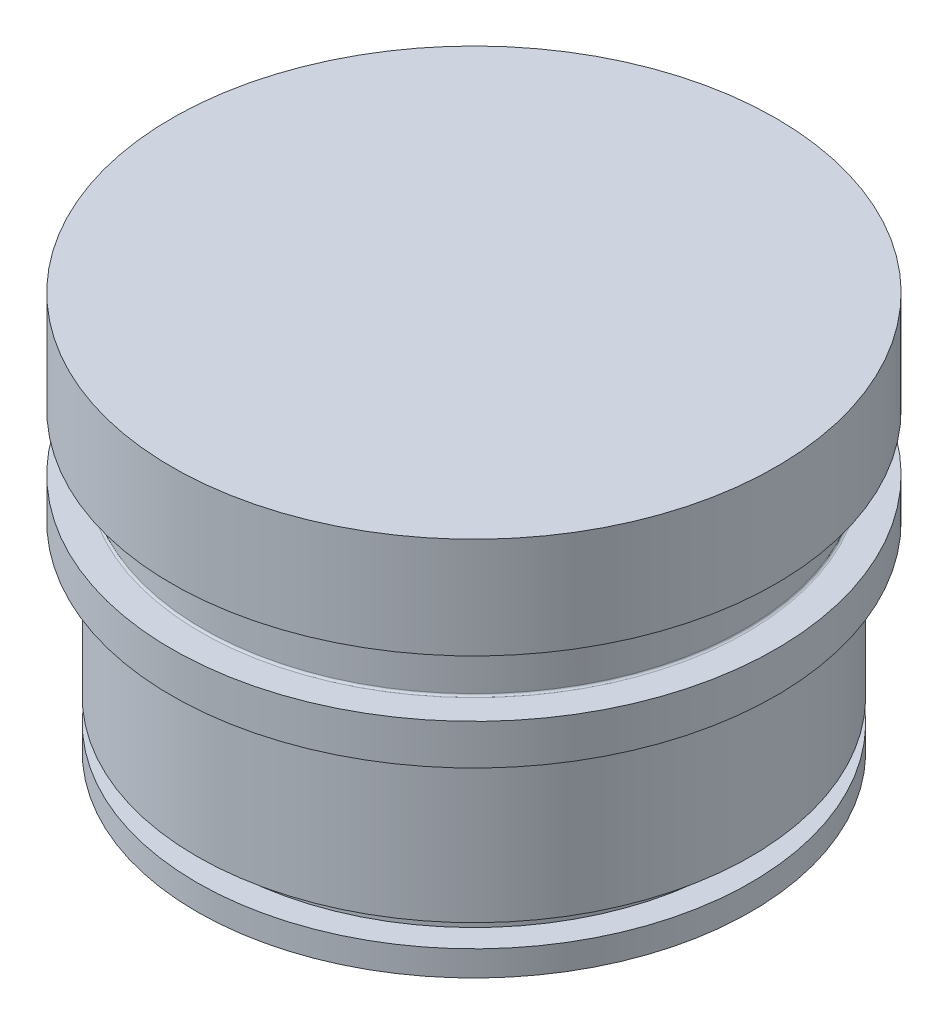
ISO-10303-21;
HEADER;
FILE_DESCRIPTION(('STEP AP214'),'2;1');
FILE_NAME('part.step','',(''),(''),'','','');
FILE_SCHEMA(('AUTOMOTIVE_DESIGN { 1 0 10303 214 1 1 1 1 }'));
ENDSEC;
DATA;
#1=APPLICATION_CONTEXT('core data for automotive mechanical design processes');
#2=APPLICATION_PROTOCOL_DEFINITION('international standard','automotive_design',2000,#1);
#3=PRODUCT_CONTEXT('',#1,'mechanical');
#4=PRODUCT('Part','Part','',(#3));
#5=PRODUCT_RELATED_PRODUCT_CATEGORY('part','',(#4));
#6=PRODUCT_DEFINITION_FORMATION('','',#4);
#7=PRODUCT_DEFINITION_CONTEXT('part definition',#1,'design');
#8=PRODUCT_DEFINITION('design','',#6,#7);
#9=PRODUCT_DEFINITION_SHAPE('','',#8);
#10=(LENGTH_UNIT() NAMED_UNIT(*) SI_UNIT(.MILLI.,.METRE.));
#11=(NAMED_UNIT(*) PLANE_ANGLE_UNIT() SI_UNIT($,.RADIAN.));
#12=(NAMED_UNIT(*) SI_UNIT($,.STERADIAN.) SOLID_ANGLE_UNIT());
#13=UNCERTAINTY_MEASURE_WITH_UNIT(LENGTH_MEASURE(1.E-05),#10,'distance_accuracy_value','');
#14=(GEOMETRIC_REPRESENTATION_CONTEXT(3) GLOBAL_UNCERTAINTY_ASSIGNED_CONTEXT((#13)) GLOBAL_UNIT_ASSIGNED_CONTEXT((#10,
#11,#12)) REPRESENTATION_CONTEXT('',''));
#15=CARTESIAN_POINT('',(0.,0.,0.));
#16=DIRECTION('',(0.,0.,1.));
#17=DIRECTION('',(1.,0.,0.));
#18=AXIS2_PLACEMENT_3D('',#15,#16,#17);
#19=CARTESIAN_POINT('',(0.,0.,0.));
#20=DIRECTION('',(0.,1.,0.));
#21=DIRECTION('',(0.,0.,1.));
#22=AXIS2_PLACEMENT_3D('',#19,#20,#21);
#23=PLANE('',#22);
#24=CARTESIAN_POINT('',(0.,0.,0.));
#25=DIRECTION('',(0.,-1.,0.));
#26=DIRECTION('',(0.,0.,-1.));
#27=AXIS2_PLACEMENT_3D('',#24,#25,#26);
#28=CIRCLE('',#27,17.399);
#29=CARTESIAN_POINT('',(0.,0.,-17.399));
#30=VERTEX_POINT('',#29);
#31=EDGE_CURVE('E57',#30,#30,#28,.T.);
#32=ORIENTED_EDGE('',*,*,#31,.T.);
#33=EDGE_LOOP('',(#32));
#34=FACE_BOUND('',#33,.T.);
#35=ADVANCED_FACE('F37',(#34),#23,.F.);
#36=CARTESIAN_POINT('',(0.,0.,0.));
#37=DIRECTION('',(0.,-1.,0.));
#38=DIRECTION('',(0.,0.,-1.));
#39=AXIS2_PLACEMENT_3D('',#36,#37,#38);
#40=CYLINDRICAL_SURFACE('',#39,17.399);
#41=ORIENTED_EDGE('',*,*,#31,.F.);
#42=EDGE_LOOP('',(#41));
#43=FACE_BOUND('',#42,.T.);
#44=CARTESIAN_POINT('',(0.,1.5875,0.));
#45=DIRECTION('',(0.,-1.,0.));
#46=DIRECTION('',(0.,0.,-1.));
#47=AXIS2_PLACEMENT_3D('',#44,#45,#46);
#48=CIRCLE('',#47,17.399);
#49=CARTESIAN_POINT('',(0.,1.5875,-17.399));
#50=VERTEX_POINT('',#49);
#51=EDGE_CURVE('E60',#50,#50,#48,.T.);
#52=ORIENTED_EDGE('',*,*,#51,.T.);
#53=EDGE_LOOP('',(#52));
#54=FACE_BOUND('',#53,.T.);
#55=ADVANCED_FACE('F103',(#43,#54),#40,.T.);
#56=CARTESIAN_POINT('',(-17.399,1.5875,0.));
#57=DIRECTION('',(0.,-1.,0.));
#58=DIRECTION('',(0.,0.,-1.));
#59=AXIS2_PLACEMENT_3D('',#56,#57,#58);
#60=PLANE('',#59);
#61=ORIENTED_EDGE('',*,*,#51,.F.);
#62=EDGE_LOOP('',(#61));
#63=FACE_BOUND('',#62,.T.);
#64=CARTESIAN_POINT('',(0.,1.5875,0.));
#65=DIRECTION('',(0.,-1.,0.));
#66=DIRECTION('',(0.,0.,-1.));
#67=AXIS2_PLACEMENT_3D('',#64,#65,#66);
#68=CIRCLE('',#67,15.7607);
#69=CARTESIAN_POINT('',(0.,1.5875,-15.7607));
#70=VERTEX_POINT('',#69);
#71=EDGE_CURVE('E63',#70,#70,#68,.T.);
#72=ORIENTED_EDGE('',*,*,#71,.T.);
#73=EDGE_LOOP('',(#72));
#74=FACE_BOUND('',#73,.T.);
#75=ADVANCED_FACE('F109',(#63,#74),#60,.F.);
#76=CARTESIAN_POINT('',(0.,0.,0.));
#77=DIRECTION('',(0.,-1.,0.));
#78=DIRECTION('',(0.,0.,-1.));
#79=AXIS2_PLACEMENT_3D('',#76,#77,#78);
#80=CYLINDRICAL_SURFACE('',#79,15.7607);
#81=ORIENTED_EDGE('',*,*,#71,.F.);
#82=EDGE_LOOP('',(#81));
#83=FACE_BOUND('',#82,.T.);
#84=CARTESIAN_POINT('',(0.,3.0099,0.));
#85=DIRECTION('',(0.,-1.,0.));
#86=DIRECTION('',(0.,0.,-1.));
#87=AXIS2_PLACEMENT_3D('',#84,#85,#86);
#88=CIRCLE('',#87,15.7607);
#89=CARTESIAN_POINT('',(0.,3.0099,-15.7607));
#90=VERTEX_POINT('',#89);
#91=EDGE_CURVE('E66',#90,#90,#88,.T.);
#92=ORIENTED_EDGE('',*,*,#91,.T.);
#93=EDGE_LOOP('',(#92));
#94=FACE_BOUND('',#93,.T.);
#95=ADVANCED_FACE('F115',(#83,#94),#80,.T.);
#96=CARTESIAN_POINT('',(-15.7607,3.0099,0.));
#97=DIRECTION('',(0.,1.,0.));
#98=DIRECTION('',(0.,0.,1.));
#99=AXIS2_PLACEMENT_3D('',#96,#97,#98);
#100=PLANE('',#99);
#101=ORIENTED_EDGE('',*,*,#91,.F.);
#102=EDGE_LOOP('',(#101));
#103=FACE_BOUND('',#102,.T.);
#104=CARTESIAN_POINT('',(0.,3.0099,0.));
#105=DIRECTION('',(0.,-1.,0.));
#106=DIRECTION('',(0.,0.,-1.));
#107=AXIS2_PLACEMENT_3D('',#104,#105,#106);
#108=CIRCLE('',#107,17.399);
#109=CARTESIAN_POINT('',(0.,3.0099,-17.399));
#110=VERTEX_POINT('',#109);
#111=EDGE_CURVE('E69',#110,#110,#108,.T.);
#112=ORIENTED_EDGE('',*,*,#111,.T.);
#113=EDGE_LOOP('',(#112));
#114=FACE_BOUND('',#113,.T.);
#115=ADVANCED_FACE('F119',(#103,#114),#100,.F.);
#116=CARTESIAN_POINT('',(0.,0.,0.));
#117=DIRECTION('',(0.,-1.,0.));
#118=DIRECTION('',(0.,0.,-1.));
#119=AXIS2_PLACEMENT_3D('',#116,#117,#118);
#120=CYLINDRICAL_SURFACE('',#119,17.399);
#121=ORIENTED_EDGE('',*,*,#111,.F.);
#122=EDGE_LOOP('',(#121));
#123=FACE_BOUND('',#122,.T.);
#124=CARTESIAN_POINT('',(0.,12.5349,0.));
#125=DIRECTION('',(0.,-1.,0.));
#126=DIRECTION('',(0.,0.,-1.));
#127=AXIS2_PLACEMENT_3D('',#124,#125,#126);
#128=CIRCLE('',#127,17.399);
#129=CARTESIAN_POINT('',(0.,12.5349,-17.399));
#130=VERTEX_POINT('',#129);
#131=EDGE_CURVE('E72',#130,#130,#128,.T.);
#132=ORIENTED_EDGE('',*,*,#131,.T.);
#133=EDGE_LOOP('',(#132));
#134=FACE_BOUND('',#133,.T.);
#135=ADVANCED_FACE('F123',(#123,#134),#120,.T.);
#136=CARTESIAN_POINT('',(-17.399,12.5349,0.));
#137=DIRECTION('',(0.,1.,0.));
#138=DIRECTION('',(0.,0.,1.));
#139=AXIS2_PLACEMENT_3D('',#136,#137,#138);
#140=PLANE('',#139);
#141=ORIENTED_EDGE('',*,*,#131,.F.);
#142=EDGE_LOOP('',(#141));
#143=FACE_BOUND('',#142,.T.);
#144=CARTESIAN_POINT('',(0.,12.5349,0.));
#145=DIRECTION('',(0.,-1.,0.));
#146=DIRECTION('',(0.,0.,-1.));
#147=AXIS2_PLACEMENT_3D('',#144,#145,#146);
#148=CIRCLE('',#147,18.9738);
#149=CARTESIAN_POINT('',(0.,12.5349,-18.9738));
#150=VERTEX_POINT('',#149);
#151=EDGE_CURVE('E75',#150,#150,#148,.T.);
#152=ORIENTED_EDGE('',*,*,#151,.T.);
#153=EDGE_LOOP('',(#152));
#154=FACE_BOUND('',#153,.T.);
#155=ADVANCED_FACE('F127',(#143,#154),#140,.F.);
#156=CARTESIAN_POINT('',(0.,0.,0.));
#157=DIRECTION('',(0.,-1.,0.));
#158=DIRECTION('',(0.,0.,-1.));
#159=AXIS2_PLACEMENT_3D('',#156,#157,#158);
#160=CYLINDRICAL_SURFACE('',#159,18.9738);
#161=ORIENTED_EDGE('',*,*,#151,.F.);
#162=EDGE_LOOP('',(#161));
#163=FACE_BOUND('',#162,.T.);
#164=CARTESIAN_POINT('',(0.,15.0749,0.));
#165=DIRECTION('',(0.,-1.,0.));
#166=DIRECTION('',(0.,0.,-1.));
#167=AXIS2_PLACEMENT_3D('',#164,#165,#166);
#168=CIRCLE('',#167,18.9738);
#169=CARTESIAN_POINT('',(0.,15.0749,-18.9738));
#170=VERTEX_POINT('',#169);
#171=EDGE_CURVE('E78',#170,#170,#168,.T.);
#172=ORIENTED_EDGE('',*,*,#171,.T.);
#173=EDGE_LOOP('',(#172));
#174=FACE_BOUND('',#173,.T.);
#175=ADVANCED_FACE('F131',(#163,#174),#160,.T.);
#176=CARTESIAN_POINT('',(-18.9738,15.0749,0.));
#177=DIRECTION('',(0.,-1.,0.));
#178=DIRECTION('',(0.,0.,-1.));
#179=AXIS2_PLACEMENT_3D('',#176,#177,#178);
#180=PLANE('',#179);
#181=CARTESIAN_POINT('',(0.,15.0749,0.));
#182=DIRECTION('',(0.,-1.,0.));
#183=DIRECTION('',(0.,0.,-1.));
#184=AXIS2_PLACEMENT_3D('',#181,#182,#183);
#185=CIRCLE('',#184,17.145);
#186=CARTESIAN_POINT('',(0.,15.0749,-17.145));
#187=VERTEX_POINT('',#186);
#188=EDGE_CURVE('E52',#187,#187,#185,.T.);
#189=ORIENTED_EDGE('',*,*,#188,.T.);
#190=EDGE_LOOP('',(#189));
#191=FACE_BOUND('',#190,.T.);
#192=ORIENTED_EDGE('',*,*,#171,.F.);
#193=EDGE_LOOP('',(#192));
#194=FACE_BOUND('',#193,.T.);
#195=ADVANCED_FACE('F135',(#191,#194),#180,.F.);
#196=CARTESIAN_POINT('',(0.,0.,0.));
#197=DIRECTION('',(0.,-1.,0.));
#198=DIRECTION('',(0.,0.,-1.));
#199=AXIS2_PLACEMENT_3D('',#196,#197,#198);
#200=CYLINDRICAL_SURFACE('',#199,17.018);
#201=CARTESIAN_POINT('',(0.,15.2019,0.));
#202=DIRECTION('',(0.,-1.,0.));
#203=DIRECTION('',(0.,0.,-1.));
#204=AXIS2_PLACEMENT_3D('',#201,#202,#203);
#205=CIRCLE('',#204,17.018);
#206=CARTESIAN_POINT('',(0.,15.2019,-17.018));
#207=VERTEX_POINT('',#206);
#208=EDGE_CURVE('E44',#207,#207,#205,.F.);
#209=ORIENTED_EDGE('',*,*,#208,.T.);
#210=EDGE_LOOP('',(#209));
#211=FACE_BOUND('',#210,.T.);
#212=CARTESIAN_POINT('',(0.,18.5039,0.));
#213=DIRECTION('',(0.,1.,0.));
#214=DIRECTION('',(0.,0.,1.));
#215=AXIS2_PLACEMENT_3D('',#212,#213,#214);
#216=CIRCLE('',#215,17.018);
#217=CARTESIAN_POINT('',(0.,18.5039,17.018));
#218=VERTEX_POINT('',#217);
#219=EDGE_CURVE('E48',#218,#218,#216,.F.);
#220=ORIENTED_EDGE('',*,*,#219,.T.);
#221=EDGE_LOOP('',(#220));
#222=FACE_BOUND('',#221,.T.);
#223=ADVANCED_FACE('F139',(#211,#222),#200,.T.);
#224=CARTESIAN_POINT('',(-17.018,18.6309,0.));
#225=DIRECTION('',(0.,1.,0.));
#226=DIRECTION('',(0.,0.,1.));
#227=AXIS2_PLACEMENT_3D('',#224,#225,#226);
#228=PLANE('',#227);
#229=CARTESIAN_POINT('',(0.,18.6309,0.));
#230=DIRECTION('',(0.,1.,0.));
#231=DIRECTION('',(0.,0.,1.));
#232=AXIS2_PLACEMENT_3D('',#229,#230,#231);
#233=CIRCLE('',#232,17.145);
#234=CARTESIAN_POINT('',(0.,18.6309,17.145));
#235=VERTEX_POINT('',#234);
#236=EDGE_CURVE('E10',#235,#235,#233,.T.);
#237=ORIENTED_EDGE('',*,*,#236,.T.);
#238=EDGE_LOOP('',(#237));
#239=FACE_BOUND('',#238,.T.);
#240=CARTESIAN_POINT('',(0.,18.6309,0.));
#241=DIRECTION('',(0.,-1.,0.));
#242=DIRECTION('',(0.,0.,-1.));
#243=AXIS2_PLACEMENT_3D('',#240,#241,#242);
#244=CIRCLE('',#243,18.9738);
#245=CARTESIAN_POINT('',(0.,18.6309,-18.9738));
#246=VERTEX_POINT('',#245);
#247=EDGE_CURVE('E81',#246,#246,#244,.T.);
#248=ORIENTED_EDGE('',*,*,#247,.T.);
#249=EDGE_LOOP('',(#248));
#250=FACE_BOUND('',#249,.T.);
#251=ADVANCED_FACE('F99',(#239,#250),#228,.F.);
#252=CARTESIAN_POINT('',(0.,0.,0.));
#253=DIRECTION('',(0.,-1.,0.));
#254=DIRECTION('',(0.,0.,-1.));
#255=AXIS2_PLACEMENT_3D('',#252,#253,#254);
#256=CYLINDRICAL_SURFACE('',#255,18.9738);
#257=ORIENTED_EDGE('',*,*,#247,.F.);
#258=EDGE_LOOP('',(#257));
#259=FACE_BOUND('',#258,.T.);
#260=CARTESIAN_POINT('',(0.,24.9809,0.));
#261=DIRECTION('',(0.,-1.,0.));
#262=DIRECTION('',(0.,0.,-1.));
#263=AXIS2_PLACEMENT_3D('',#260,#261,#262);
#264=CIRCLE('',#263,18.9738);
#265=CARTESIAN_POINT('',(0.,24.9809,-18.9738));
#266=VERTEX_POINT('',#265);
#267=EDGE_CURVE('E84',#266,#266,#264,.T.);
#268=ORIENTED_EDGE('',*,*,#267,.T.);
#269=EDGE_LOOP('',(#268));
#270=FACE_BOUND('',#269,.T.);
#271=ADVANCED_FACE('F88',(#259,#270),#256,.T.);
#272=CARTESIAN_POINT('',(-18.9738,24.9809,0.));
#273=DIRECTION('',(0.,-1.,0.));
#274=DIRECTION('',(0.,0.,-1.));
#275=AXIS2_PLACEMENT_3D('',#272,#273,#274);
#276=PLANE('',#275);
#277=ORIENTED_EDGE('',*,*,#267,.F.);
#278=EDGE_LOOP('',(#277));
#279=FACE_BOUND('',#278,.T.);
#280=ADVANCED_FACE('F90',(#279),#276,.F.);
#281=CARTESIAN_POINT('',(0.,15.2019,0.));
#282=DIRECTION('',(0.,-1.,0.));
#283=DIRECTION('',(0.,0.,-1.));
#284=AXIS2_PLACEMENT_3D('',#281,#282,#283);
#285=TOROIDAL_SURFACE('',#284,17.145,0.127);
#286=ORIENTED_EDGE('',*,*,#208,.F.);
#287=EDGE_LOOP('',(#286));
#288=FACE_BOUND('',#287,.T.);
#289=ORIENTED_EDGE('',*,*,#188,.F.);
#290=EDGE_LOOP('',(#289));
#291=FACE_BOUND('',#290,.T.);
#292=ADVANCED_FACE('F92',(#288,#291),#285,.F.);
#293=CARTESIAN_POINT('',(0.,18.5039,0.));
#294=DIRECTION('',(0.,1.,0.));
#295=DIRECTION('',(0.,0.,1.));
#296=AXIS2_PLACEMENT_3D('',#293,#294,#295);
#297=TOROIDAL_SURFACE('',#296,17.145,0.127);
#298=ORIENTED_EDGE('',*,*,#236,.F.);
#299=EDGE_LOOP('',(#298));
#300=FACE_BOUND('',#299,.T.);
#301=ORIENTED_EDGE('',*,*,#219,.F.);
#302=EDGE_LOOP('',(#301));
#303=FACE_BOUND('',#302,.T.);
#304=ADVANCED_FACE('F39',(#300,#303),#297,.F.);
#305=CLOSED_SHELL('',(#35,#55,#75,#95,#115,#135,#155,#175,#195,#223,#251,#271,#280,#292,#304));
#306=MANIFOLD_SOLID_BREP('B2',#305);
#307=ADVANCED_BREP_SHAPE_REPRESENTATION('',(#18,#306),#14);
#308=SHAPE_DEFINITION_REPRESENTATION(#9,#307);
ENDSEC;
END-ISO-10303-21;
